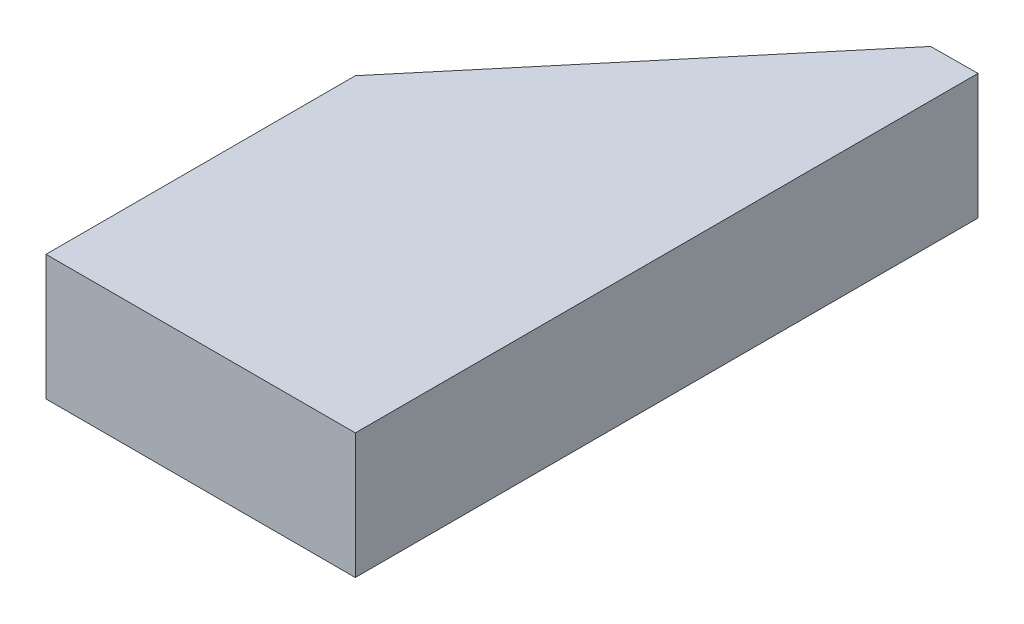
ISO-10303-21;
HEADER;
FILE_DESCRIPTION(('STEP AP214'),'2;1');
FILE_NAME('part.step','',(''),(''),'','','');
FILE_SCHEMA(('AUTOMOTIVE_DESIGN { 1 0 10303 214 1 1 1 1 }'));
ENDSEC;
DATA;
#1=APPLICATION_CONTEXT('core data for automotive mechanical design processes');
#2=APPLICATION_PROTOCOL_DEFINITION('international standard','automotive_design',2000,#1);
#3=PRODUCT_CONTEXT('',#1,'mechanical');
#4=PRODUCT('Part','Part','',(#3));
#5=PRODUCT_RELATED_PRODUCT_CATEGORY('part','',(#4));
#6=PRODUCT_DEFINITION_FORMATION('','',#4);
#7=PRODUCT_DEFINITION_CONTEXT('part definition',#1,'design');
#8=PRODUCT_DEFINITION('design','',#6,#7);
#9=PRODUCT_DEFINITION_SHAPE('','',#8);
#10=(LENGTH_UNIT() NAMED_UNIT(*) SI_UNIT(.MILLI.,.METRE.));
#11=(NAMED_UNIT(*) PLANE_ANGLE_UNIT() SI_UNIT($,.RADIAN.));
#12=(NAMED_UNIT(*) SI_UNIT($,.STERADIAN.) SOLID_ANGLE_UNIT());
#13=UNCERTAINTY_MEASURE_WITH_UNIT(LENGTH_MEASURE(1.E-05),#10,'distance_accuracy_value','');
#14=(GEOMETRIC_REPRESENTATION_CONTEXT(3) GLOBAL_UNCERTAINTY_ASSIGNED_CONTEXT((#13)) GLOBAL_UNIT_ASSIGNED_CONTEXT((#10,
#11,#12)) REPRESENTATION_CONTEXT('',''));
#15=CARTESIAN_POINT('',(0.,0.,0.));
#16=DIRECTION('',(0.,0.,1.));
#17=DIRECTION('',(1.,0.,0.));
#18=AXIS2_PLACEMENT_3D('',#15,#16,#17);
#19=CARTESIAN_POINT('',(1.88196721311474,0.,7.9));
#20=DIRECTION('',(1.,0.,0.));
#21=DIRECTION('',(0.,0.,-1.));
#22=AXIS2_PLACEMENT_3D('',#19,#20,#21);
#23=PLANE('',#22);
#24=DIRECTION('',(0.,0.,-1.));
#25=VECTOR('',#24,1.);
#26=CARTESIAN_POINT('',(1.88196721311474,0.,7.9));
#27=LINE('',#26,#25);
#28=CARTESIAN_POINT('',(1.88196721311474,0.,6.7));
#29=VERTEX_POINT('',#28);
#30=CARTESIAN_POINT('',(1.88196721311474,0.,1.19113572487986));
#31=VERTEX_POINT('',#30);
#32=EDGE_CURVE('E215',#29,#31,#27,.T.);
#33=ORIENTED_EDGE('',*,*,#32,.T.);
#34=DIRECTION('',(0.,1.,0.));
#35=VECTOR('',#34,1.);
#36=CARTESIAN_POINT('',(1.88196721311474,0.,1.19113572487986));
#37=LINE('',#36,#35);
#38=CARTESIAN_POINT('',(1.88196721311474,2.,1.19113572487986));
#39=VERTEX_POINT('',#38);
#40=EDGE_CURVE('E195',#31,#39,#37,.T.);
#41=ORIENTED_EDGE('',*,*,#40,.T.);
#42=DIRECTION('',(0.,0.,-1.));
#43=VECTOR('',#42,1.);
#44=CARTESIAN_POINT('',(1.88196721311474,2.,7.9));
#45=LINE('',#44,#43);
#46=CARTESIAN_POINT('',(1.88196721311474,2.,6.7));
#47=VERTEX_POINT('',#46);
#48=EDGE_CURVE('E204',#47,#39,#45,.T.);
#49=ORIENTED_EDGE('',*,*,#48,.F.);
#50=DIRECTION('',(0.,-1.,0.));
#51=VECTOR('',#50,1.);
#52=CARTESIAN_POINT('',(1.88196721311474,0.,6.7));
#53=LINE('',#52,#51);
#54=EDGE_CURVE('E201',#47,#29,#53,.T.);
#55=ORIENTED_EDGE('',*,*,#54,.T.);
#56=EDGE_LOOP('',(#33,#41,#49,#55));
#57=FACE_BOUND('',#56,.T.);
#58=ADVANCED_FACE('F43',(#57),#23,.T.);
#59=CARTESIAN_POINT('',(7.38196721311474,0.,7.9));
#60=DIRECTION('',(-1.,0.,0.));
#61=DIRECTION('',(0.,0.,1.));
#62=AXIS2_PLACEMENT_3D('',#59,#60,#61);
#63=PLANE('',#62);
#64=DIRECTION('',(0.,0.,-1.));
#65=VECTOR('',#64,1.);
#66=CARTESIAN_POINT('',(7.38196721311474,2.,7.9));
#67=LINE('',#66,#65);
#68=CARTESIAN_POINT('',(7.38196721311474,2.,6.7));
#69=VERTEX_POINT('',#68);
#70=CARTESIAN_POINT('',(7.38196721311474,2.,1.19113572487986));
#71=VERTEX_POINT('',#70);
#72=EDGE_CURVE('E207',#69,#71,#67,.T.);
#73=ORIENTED_EDGE('',*,*,#72,.T.);
#74=DIRECTION('',(0.,1.,0.));
#75=VECTOR('',#74,1.);
#76=CARTESIAN_POINT('',(7.38196721311474,0.,1.19113572487986));
#77=LINE('',#76,#75);
#78=CARTESIAN_POINT('',(7.38196721311474,0.,1.19113572487986));
#79=VERTEX_POINT('',#78);
#80=EDGE_CURVE('E199',#79,#71,#77,.T.);
#81=ORIENTED_EDGE('',*,*,#80,.F.);
#82=DIRECTION('',(0.,0.,-1.));
#83=VECTOR('',#82,1.);
#84=CARTESIAN_POINT('',(7.38196721311474,0.,7.9));
#85=LINE('',#84,#83);
#86=CARTESIAN_POINT('',(7.38196721311474,0.,6.7));
#87=VERTEX_POINT('',#86);
#88=EDGE_CURVE('E213',#87,#79,#85,.T.);
#89=ORIENTED_EDGE('',*,*,#88,.F.);
#90=DIRECTION('',(0.,1.,0.));
#91=VECTOR('',#90,1.);
#92=CARTESIAN_POINT('',(7.38196721311474,0.,6.7));
#93=LINE('',#92,#91);
#94=EDGE_CURVE('E210',#87,#69,#93,.T.);
#95=ORIENTED_EDGE('',*,*,#94,.T.);
#96=EDGE_LOOP('',(#73,#81,#89,#95));
#97=FACE_BOUND('',#96,.T.);
#98=ADVANCED_FACE('F300',(#97),#63,.T.);
#99=CARTESIAN_POINT('',(0.681967213114738,2.,7.9));
#100=DIRECTION('',(0.,-1.,0.));
#101=DIRECTION('',(1.,0.,0.));
#102=AXIS2_PLACEMENT_3D('',#99,#100,#101);
#103=PLANE('',#102);
#104=ORIENTED_EDGE('',*,*,#48,.T.);
#105=DIRECTION('',(-1.,0.,0.));
#106=VECTOR('',#105,1.);
#107=CARTESIAN_POINT('',(1.88196721311474,2.,1.19113572487986));
#108=LINE('',#107,#106);
#109=EDGE_CURVE('E192',#71,#39,#108,.T.);
#110=ORIENTED_EDGE('',*,*,#109,.F.);
#111=ORIENTED_EDGE('',*,*,#72,.F.);
#112=DIRECTION('',(-1.,0.,0.));
#113=VECTOR('',#112,1.);
#114=CARTESIAN_POINT('',(0.,2.,6.7));
#115=LINE('',#114,#113);
#116=EDGE_CURVE('E208',#69,#47,#115,.T.);
#117=ORIENTED_EDGE('',*,*,#116,.T.);
#118=EDGE_LOOP('',(#104,#110,#111,#117));
#119=FACE_BOUND('',#118,.T.);
#120=ADVANCED_FACE('F306',(#119),#103,.T.);
#121=CARTESIAN_POINT('',(0.681967213114738,0.,7.9));
#122=DIRECTION('',(0.,1.,0.));
#123=DIRECTION('',(0.,0.,1.));
#124=AXIS2_PLACEMENT_3D('',#121,#122,#123);
#125=PLANE('',#124);
#126=DIRECTION('',(0.642332241079395,0.,-0.766426312224419));
#127=VECTOR('',#126,1.);
#128=CARTESIAN_POINT('',(7.38196721311474,0.,-7.99439287567833));
#129=LINE('',#128,#127);
#130=CARTESIAN_POINT('',(0.681967213114738,0.,0.));
#131=VERTEX_POINT('',#130);
#132=CARTESIAN_POINT('',(1.94947445264716,0.,-1.51238072322219));
#133=VERTEX_POINT('',#132);
#134=EDGE_CURVE('E187',#131,#133,#129,.T.);
#135=ORIENTED_EDGE('',*,*,#134,.T.);
#136=DIRECTION('',(-0.807139997417087,0.,-0.590360080433582));
#137=VECTOR('',#136,1.);
#138=CARTESIAN_POINT('',(2.7061406262246,0.,-0.958938316051146));
#139=LINE('',#138,#137);
#140=CARTESIAN_POINT('',(2.7061406262246,0.,-0.958938316051146));
#141=VERTEX_POINT('',#140);
#142=EDGE_CURVE('E246',#141,#133,#139,.T.);
#143=ORIENTED_EDGE('',*,*,#142,.F.);
#144=DIRECTION('',(0.590360080433582,0.,-0.807139997417087));
#145=VECTOR('',#144,1.);
#146=CARTESIAN_POINT('',(2.36139011212092,0.,-0.4875955910166));
#147=LINE('',#146,#145);
#148=CARTESIAN_POINT('',(2.36139011212092,0.,-0.4875955910166));
#149=VERTEX_POINT('',#148);
#150=EDGE_CURVE('E262',#149,#141,#147,.T.);
#151=ORIENTED_EDGE('',*,*,#150,.F.);
#152=DIRECTION('',(0.,0.,-1.));
#153=VECTOR('',#152,1.);
#154=CARTESIAN_POINT('',(2.36139011212092,0.,0.));
#155=LINE('',#154,#153);
#156=CARTESIAN_POINT('',(2.36139011212092,0.,0.));
#157=VERTEX_POINT('',#156);
#158=EDGE_CURVE('E259',#157,#149,#155,.T.);
#159=ORIENTED_EDGE('',*,*,#158,.F.);
#160=DIRECTION('',(-1.,0.,0.));
#161=VECTOR('',#160,1.);
#162=CARTESIAN_POINT('',(7.38196721311474,0.,0.));
#163=LINE('',#162,#161);
#164=CARTESIAN_POINT('',(7.38196721311474,0.,0.));
#165=VERTEX_POINT('',#164);
#166=EDGE_CURVE('E252',#165,#157,#163,.T.);
#167=ORIENTED_EDGE('',*,*,#166,.F.);
#168=DIRECTION('',(0.,0.,1.));
#169=VECTOR('',#168,1.);
#170=CARTESIAN_POINT('',(7.38196721311474,0.,-1.2));
#171=LINE('',#170,#169);
#172=CARTESIAN_POINT('',(7.38196721311474,0.,-7.99439287567833));
#173=VERTEX_POINT('',#172);
#174=EDGE_CURVE('E250',#173,#165,#171,.T.);
#175=ORIENTED_EDGE('',*,*,#174,.F.);
#176=DIRECTION('',(0.999974178282738,0.,-0.00718629026424856));
#177=VECTOR('',#176,1.);
#178=CARTESIAN_POINT('',(8.58196721311474,0.,-8.003016646676));
#179=LINE('',#178,#177);
#180=CARTESIAN_POINT('',(8.58196721311474,0.,-8.003016646676));
#181=VERTEX_POINT('',#180);
#182=EDGE_CURVE('E173',#173,#181,#179,.T.);
#183=ORIENTED_EDGE('',*,*,#182,.T.);
#184=DIRECTION('',(0.,0.,-1.));
#185=VECTOR('',#184,1.);
#186=CARTESIAN_POINT('',(8.58196721311474,0.,7.9));
#187=LINE('',#186,#185);
#188=CARTESIAN_POINT('',(8.58196721311474,0.,7.9));
#189=VERTEX_POINT('',#188);
#190=EDGE_CURVE('E234',#189,#181,#187,.T.);
#191=ORIENTED_EDGE('',*,*,#190,.F.);
#192=DIRECTION('',(1.,0.,0.));
#193=VECTOR('',#192,1.);
#194=CARTESIAN_POINT('',(0.681967213114738,0.,7.9));
#195=LINE('',#194,#193);
#196=CARTESIAN_POINT('',(0.681967213114738,0.,7.9));
#197=VERTEX_POINT('',#196);
#198=EDGE_CURVE('E225',#197,#189,#195,.T.);
#199=ORIENTED_EDGE('',*,*,#198,.F.);
#200=DIRECTION('',(0.,0.,-1.));
#201=VECTOR('',#200,1.);
#202=CARTESIAN_POINT('',(0.681967213114738,0.,7.9));
#203=LINE('',#202,#201);
#204=EDGE_CURVE('E154',#197,#131,#203,.T.);
#205=ORIENTED_EDGE('',*,*,#204,.T.);
#206=EDGE_LOOP('',(#135,#143,#151,#159,#167,#175,#183,#191,#199,#205));
#207=FACE_BOUND('',#206,.T.);
#208=DIRECTION('',(-1.,0.,0.));
#209=VECTOR('',#208,1.);
#210=CARTESIAN_POINT('',(1.88196721311474,0.,1.19113572487986));
#211=LINE('',#210,#209);
#212=EDGE_CURVE('E193',#79,#31,#211,.T.);
#213=ORIENTED_EDGE('',*,*,#212,.T.);
#214=ORIENTED_EDGE('',*,*,#32,.F.);
#215=DIRECTION('',(1.,0.,0.));
#216=VECTOR('',#215,1.);
#217=CARTESIAN_POINT('',(0.,0.,6.7));
#218=LINE('',#217,#216);
#219=EDGE_CURVE('E203',#29,#87,#218,.T.);
#220=ORIENTED_EDGE('',*,*,#219,.T.);
#221=ORIENTED_EDGE('',*,*,#88,.T.);
#222=EDGE_LOOP('',(#213,#214,#220,#221));
#223=FACE_BOUND('',#222,.T.);
#224=ADVANCED_FACE('F240',(#207,#223),#125,.F.);
#225=CARTESIAN_POINT('',(0.681967213114738,0.,7.9));
#226=DIRECTION('',(1.,0.,0.));
#227=DIRECTION('',(0.,0.,-1.));
#228=AXIS2_PLACEMENT_3D('',#225,#226,#227);
#229=PLANE('',#228);
#230=DIRECTION('',(0.,0.,-1.));
#231=VECTOR('',#230,1.);
#232=CARTESIAN_POINT('',(0.681967213114738,3.2,7.9));
#233=LINE('',#232,#231);
#234=CARTESIAN_POINT('',(0.681967213114738,3.2,7.9));
#235=VERTEX_POINT('',#234);
#236=CARTESIAN_POINT('',(0.681967213114738,3.2,0.));
#237=VERTEX_POINT('',#236);
#238=EDGE_CURVE('E65',#235,#237,#233,.T.);
#239=ORIENTED_EDGE('',*,*,#238,.T.);
#240=DIRECTION('',(0.,-1.,0.));
#241=VECTOR('',#240,1.);
#242=CARTESIAN_POINT('',(0.681967213114738,3.2,0.));
#243=LINE('',#242,#241);
#244=EDGE_CURVE('E190',#237,#131,#243,.T.);
#245=ORIENTED_EDGE('',*,*,#244,.T.);
#246=ORIENTED_EDGE('',*,*,#204,.F.);
#247=DIRECTION('',(0.,-1.,0.));
#248=VECTOR('',#247,1.);
#249=CARTESIAN_POINT('',(0.681967213114738,0.,7.9));
#250=LINE('',#249,#248);
#251=EDGE_CURVE('E218',#235,#197,#250,.T.);
#252=ORIENTED_EDGE('',*,*,#251,.F.);
#253=EDGE_LOOP('',(#239,#245,#246,#252));
#254=FACE_BOUND('',#253,.T.);
#255=ADVANCED_FACE('F45',(#254),#229,.F.);
#256=CARTESIAN_POINT('',(8.58196721311474,0.,7.9));
#257=DIRECTION('',(-1.,0.,0.));
#258=DIRECTION('',(0.,0.,1.));
#259=AXIS2_PLACEMENT_3D('',#256,#257,#258);
#260=PLANE('',#259);
#261=ORIENTED_EDGE('',*,*,#190,.T.);
#262=DIRECTION('',(0.,-1.,0.));
#263=VECTOR('',#262,1.);
#264=CARTESIAN_POINT('',(8.58196721311474,3.2,-8.003016646676));
#265=LINE('',#264,#263);
#266=CARTESIAN_POINT('',(8.58196721311474,3.2,-8.003016646676));
#267=VERTEX_POINT('',#266);
#268=EDGE_CURVE('E181',#267,#181,#265,.T.);
#269=ORIENTED_EDGE('',*,*,#268,.F.);
#270=DIRECTION('',(0.,0.,-1.));
#271=VECTOR('',#270,1.);
#272=CARTESIAN_POINT('',(8.58196721311474,3.2,7.9));
#273=LINE('',#272,#271);
#274=CARTESIAN_POINT('',(8.58196721311474,3.2,7.9));
#275=VERTEX_POINT('',#274);
#276=EDGE_CURVE('E232',#275,#267,#273,.T.);
#277=ORIENTED_EDGE('',*,*,#276,.F.);
#278=DIRECTION('',(0.,1.,0.));
#279=VECTOR('',#278,1.);
#280=CARTESIAN_POINT('',(8.58196721311474,0.,7.9));
#281=LINE('',#280,#279);
#282=EDGE_CURVE('E227',#189,#275,#281,.T.);
#283=ORIENTED_EDGE('',*,*,#282,.F.);
#284=EDGE_LOOP('',(#261,#269,#277,#283));
#285=FACE_BOUND('',#284,.T.);
#286=ADVANCED_FACE('F274',(#285),#260,.F.);
#287=CARTESIAN_POINT('',(0.681967213114738,3.2,7.9));
#288=DIRECTION('',(0.,-1.,0.));
#289=DIRECTION('',(1.,0.,0.));
#290=AXIS2_PLACEMENT_3D('',#287,#288,#289);
#291=PLANE('',#290);
#292=ORIENTED_EDGE('',*,*,#276,.T.);
#293=DIRECTION('',(0.999974178282738,0.,-0.00718629026424856));
#294=VECTOR('',#293,1.);
#295=CARTESIAN_POINT('',(8.58196721311474,3.2,-8.003016646676));
#296=LINE('',#295,#294);
#297=CARTESIAN_POINT('',(7.38196721311474,3.2,-7.99439287567833));
#298=VERTEX_POINT('',#297);
#299=EDGE_CURVE('E183',#298,#267,#296,.T.);
#300=ORIENTED_EDGE('',*,*,#299,.F.);
#301=DIRECTION('',(0.642332241079395,0.,-0.766426312224419));
#302=VECTOR('',#301,1.);
#303=CARTESIAN_POINT('',(7.38196721311474,3.2,-7.99439287567833));
#304=LINE('',#303,#302);
#305=EDGE_CURVE('E179',#237,#298,#304,.T.);
#306=ORIENTED_EDGE('',*,*,#305,.F.);
#307=ORIENTED_EDGE('',*,*,#238,.F.);
#308=DIRECTION('',(-1.,0.,0.));
#309=VECTOR('',#308,1.);
#310=CARTESIAN_POINT('',(0.681967213114738,3.2,7.9));
#311=LINE('',#310,#309);
#312=EDGE_CURVE('E229',#275,#235,#311,.T.);
#313=ORIENTED_EDGE('',*,*,#312,.F.);
#314=EDGE_LOOP('',(#292,#300,#306,#307,#313));
#315=FACE_BOUND('',#314,.T.);
#316=ADVANCED_FACE('F323',(#315),#291,.F.);
#317=CARTESIAN_POINT('',(0.,0.,7.9));
#318=DIRECTION('',(0.,0.,-1.));
#319=DIRECTION('',(-1.,0.,0.));
#320=AXIS2_PLACEMENT_3D('',#317,#318,#319);
#321=PLANE('',#320);
#322=ORIENTED_EDGE('',*,*,#251,.T.);
#323=ORIENTED_EDGE('',*,*,#198,.T.);
#324=ORIENTED_EDGE('',*,*,#282,.T.);
#325=ORIENTED_EDGE('',*,*,#312,.T.);
#326=EDGE_LOOP('',(#322,#323,#324,#325));
#327=FACE_BOUND('',#326,.T.);
#328=ADVANCED_FACE('F319',(#327),#321,.F.);
#329=CARTESIAN_POINT('',(0.,0.,6.7));
#330=DIRECTION('',(0.,0.,-1.));
#331=DIRECTION('',(-1.,0.,0.));
#332=AXIS2_PLACEMENT_3D('',#329,#330,#331);
#333=PLANE('',#332);
#334=ORIENTED_EDGE('',*,*,#54,.F.);
#335=ORIENTED_EDGE('',*,*,#116,.F.);
#336=ORIENTED_EDGE('',*,*,#94,.F.);
#337=ORIENTED_EDGE('',*,*,#219,.F.);
#338=EDGE_LOOP('',(#334,#335,#336,#337));
#339=FACE_BOUND('',#338,.T.);
#340=ADVANCED_FACE('F316',(#339),#333,.T.);
#341=CARTESIAN_POINT('',(1.88196721311474,0.,1.19113572487986));
#342=DIRECTION('',(0.,0.,-1.));
#343=DIRECTION('',(-1.,0.,0.));
#344=AXIS2_PLACEMENT_3D('',#341,#342,#343);
#345=PLANE('',#344);
#346=ORIENTED_EDGE('',*,*,#109,.T.);
#347=ORIENTED_EDGE('',*,*,#40,.F.);
#348=ORIENTED_EDGE('',*,*,#212,.F.);
#349=ORIENTED_EDGE('',*,*,#80,.T.);
#350=EDGE_LOOP('',(#346,#347,#348,#349));
#351=FACE_BOUND('',#350,.T.);
#352=ADVANCED_FACE('F310',(#351),#345,.F.);
#353=CARTESIAN_POINT('',(8.58196721311474,3.2,-8.003016646676));
#354=DIRECTION('',(-0.00718629026424856,0.,-0.999974178282738));
#355=DIRECTION('',(-0.999974178282739,0.,0.00718629026424856));
#356=AXIS2_PLACEMENT_3D('',#353,#354,#355);
#357=PLANE('',#356);
#358=ORIENTED_EDGE('',*,*,#268,.T.);
#359=ORIENTED_EDGE('',*,*,#182,.F.);
#360=DIRECTION('',(0.,-1.,0.));
#361=VECTOR('',#360,1.);
#362=CARTESIAN_POINT('',(7.38196721311474,2.,-7.99439287567833));
#363=LINE('',#362,#361);
#364=CARTESIAN_POINT('',(7.38196721311474,2.,-7.99439287567833));
#365=VERTEX_POINT('',#364);
#366=EDGE_CURVE('E159',#365,#173,#363,.T.);
#367=ORIENTED_EDGE('',*,*,#366,.F.);
#368=DIRECTION('',(0.,-1.,0.));
#369=VECTOR('',#368,1.);
#370=CARTESIAN_POINT('',(7.38196721311474,3.2,-7.99439287567833));
#371=LINE('',#370,#369);
#372=EDGE_CURVE('E171',#298,#365,#371,.T.);
#373=ORIENTED_EDGE('',*,*,#372,.F.);
#374=ORIENTED_EDGE('',*,*,#299,.T.);
#375=EDGE_LOOP('',(#358,#359,#367,#373,#374));
#376=FACE_BOUND('',#375,.T.);
#377=ADVANCED_FACE('F169',(#376),#357,.T.);
#378=CARTESIAN_POINT('',(7.38196721311474,3.2,-7.99439287567833));
#379=DIRECTION('',(-0.766426312224419,0.,-0.642332241079395));
#380=DIRECTION('',(-0.642332241079395,0.,0.766426312224419));
#381=AXIS2_PLACEMENT_3D('',#378,#379,#380);
#382=PLANE('',#381);
#383=DIRECTION('',(0.,1.,0.));
#384=VECTOR('',#383,1.);
#385=CARTESIAN_POINT('',(1.94947445264716,3.2,-1.5123807232222));
#386=LINE('',#385,#384);
#387=CARTESIAN_POINT('',(1.94947445264716,2.,-1.51238072322219));
#388=VERTEX_POINT('',#387);
#389=EDGE_CURVE('E11',#133,#388,#386,.T.);
#390=ORIENTED_EDGE('',*,*,#389,.F.);
#391=ORIENTED_EDGE('',*,*,#134,.F.);
#392=ORIENTED_EDGE('',*,*,#244,.F.);
#393=ORIENTED_EDGE('',*,*,#305,.T.);
#394=ORIENTED_EDGE('',*,*,#372,.T.);
#395=DIRECTION('',(-0.642332241079395,0.,0.766426312224419));
#396=VECTOR('',#395,1.);
#397=CARTESIAN_POINT('',(7.38196721311474,2.,-7.99439287567833));
#398=LINE('',#397,#396);
#399=EDGE_CURVE('E51',#365,#388,#398,.T.);
#400=ORIENTED_EDGE('',*,*,#399,.T.);
#401=EDGE_LOOP('',(#390,#391,#392,#393,#394,#400));
#402=FACE_BOUND('',#401,.T.);
#403=ADVANCED_FACE('F177',(#402),#382,.T.);
#404=CARTESIAN_POINT('',(2.7061406262246,2.,-0.958938316051146));
#405=DIRECTION('',(-0.590360080433582,0.,0.807139997417087));
#406=DIRECTION('',(0.807139997417087,0.,0.590360080433582));
#407=AXIS2_PLACEMENT_3D('',#404,#405,#406);
#408=PLANE('',#407);
#409=ORIENTED_EDGE('',*,*,#389,.T.);
#410=DIRECTION('',(-0.807139997417087,0.,-0.590360080433582));
#411=VECTOR('',#410,1.);
#412=CARTESIAN_POINT('',(2.7061406262246,2.,-0.958938316051146));
#413=LINE('',#412,#411);
#414=CARTESIAN_POINT('',(2.7061406262246,2.,-0.958938316051146));
#415=VERTEX_POINT('',#414);
#416=EDGE_CURVE('E58',#415,#388,#413,.T.);
#417=ORIENTED_EDGE('',*,*,#416,.F.);
#418=DIRECTION('',(0.,-1.,0.));
#419=VECTOR('',#418,1.);
#420=CARTESIAN_POINT('',(2.7061406262246,2.,-0.958938316051146));
#421=LINE('',#420,#419);
#422=EDGE_CURVE('E247',#415,#141,#421,.T.);
#423=ORIENTED_EDGE('',*,*,#422,.T.);
#424=ORIENTED_EDGE('',*,*,#142,.T.);
#425=EDGE_LOOP('',(#409,#417,#423,#424));
#426=FACE_BOUND('',#425,.T.);
#427=ADVANCED_FACE('F245',(#426),#408,.F.);
#428=CARTESIAN_POINT('',(2.36139011212092,2.,-0.4875955910166));
#429=DIRECTION('',(-0.807139997417087,0.,-0.590360080433582));
#430=DIRECTION('',(-0.590360080433582,0.,0.807139997417087));
#431=AXIS2_PLACEMENT_3D('',#428,#429,#430);
#432=PLANE('',#431);
#433=ORIENTED_EDGE('',*,*,#150,.T.);
#434=ORIENTED_EDGE('',*,*,#422,.F.);
#435=DIRECTION('',(0.590360080433582,0.,-0.807139997417087));
#436=VECTOR('',#435,1.);
#437=CARTESIAN_POINT('',(2.36139011212092,2.,-0.4875955910166));
#438=LINE('',#437,#436);
#439=CARTESIAN_POINT('',(2.36139011212092,2.,-0.4875955910166));
#440=VERTEX_POINT('',#439);
#441=EDGE_CURVE('E174',#440,#415,#438,.T.);
#442=ORIENTED_EDGE('',*,*,#441,.F.);
#443=DIRECTION('',(0.,-1.,0.));
#444=VECTOR('',#443,1.);
#445=CARTESIAN_POINT('',(2.36139011212092,2.,-0.4875955910166));
#446=LINE('',#445,#444);
#447=EDGE_CURVE('E265',#440,#149,#446,.T.);
#448=ORIENTED_EDGE('',*,*,#447,.T.);
#449=EDGE_LOOP('',(#433,#434,#442,#448));
#450=FACE_BOUND('',#449,.T.);
#451=ADVANCED_FACE('F288',(#450),#432,.F.);
#452=CARTESIAN_POINT('',(2.36139011212092,2.,0.));
#453=DIRECTION('',(-1.,0.,0.));
#454=DIRECTION('',(0.,0.,1.));
#455=AXIS2_PLACEMENT_3D('',#452,#453,#454);
#456=PLANE('',#455);
#457=ORIENTED_EDGE('',*,*,#158,.T.);
#458=ORIENTED_EDGE('',*,*,#447,.F.);
#459=DIRECTION('',(0.,0.,-1.));
#460=VECTOR('',#459,1.);
#461=CARTESIAN_POINT('',(2.36139011212092,2.,0.));
#462=LINE('',#461,#460);
#463=CARTESIAN_POINT('',(2.36139011212092,2.,0.));
#464=VERTEX_POINT('',#463);
#465=EDGE_CURVE('E283',#464,#440,#462,.T.);
#466=ORIENTED_EDGE('',*,*,#465,.F.);
#467=DIRECTION('',(0.,-1.,0.));
#468=VECTOR('',#467,1.);
#469=CARTESIAN_POINT('',(2.36139011212092,2.,0.));
#470=LINE('',#469,#468);
#471=EDGE_CURVE('E267',#464,#157,#470,.T.);
#472=ORIENTED_EDGE('',*,*,#471,.T.);
#473=EDGE_LOOP('',(#457,#458,#466,#472));
#474=FACE_BOUND('',#473,.T.);
#475=ADVANCED_FACE('F290',(#474),#456,.F.);
#476=CARTESIAN_POINT('',(7.38196721311474,2.,0.));
#477=DIRECTION('',(0.,0.,1.));
#478=DIRECTION('',(1.,0.,0.));
#479=AXIS2_PLACEMENT_3D('',#476,#477,#478);
#480=PLANE('',#479);
#481=ORIENTED_EDGE('',*,*,#166,.T.);
#482=ORIENTED_EDGE('',*,*,#471,.F.);
#483=DIRECTION('',(-1.,0.,0.));
#484=VECTOR('',#483,1.);
#485=CARTESIAN_POINT('',(7.38196721311474,2.,0.));
#486=LINE('',#485,#484);
#487=CARTESIAN_POINT('',(7.38196721311474,2.,0.));
#488=VERTEX_POINT('',#487);
#489=EDGE_CURVE('E163',#488,#464,#486,.T.);
#490=ORIENTED_EDGE('',*,*,#489,.F.);
#491=DIRECTION('',(0.,-1.,0.));
#492=VECTOR('',#491,1.);
#493=CARTESIAN_POINT('',(7.38196721311474,2.,0.));
#494=LINE('',#493,#492);
#495=EDGE_CURVE('E161',#488,#165,#494,.T.);
#496=ORIENTED_EDGE('',*,*,#495,.T.);
#497=EDGE_LOOP('',(#481,#482,#490,#496));
#498=FACE_BOUND('',#497,.T.);
#499=ADVANCED_FACE('F280',(#498),#480,.F.);
#500=CARTESIAN_POINT('',(7.38196721311474,2.,-1.2));
#501=DIRECTION('',(1.,0.,0.));
#502=DIRECTION('',(0.,0.,-1.));
#503=AXIS2_PLACEMENT_3D('',#500,#501,#502);
#504=PLANE('',#503);
#505=ORIENTED_EDGE('',*,*,#174,.T.);
#506=ORIENTED_EDGE('',*,*,#495,.F.);
#507=DIRECTION('',(0.,0.,1.));
#508=VECTOR('',#507,1.);
#509=CARTESIAN_POINT('',(7.38196721311474,2.,-7.99439287567833));
#510=LINE('',#509,#508);
#511=EDGE_CURVE('E149',#365,#488,#510,.T.);
#512=ORIENTED_EDGE('',*,*,#511,.F.);
#513=ORIENTED_EDGE('',*,*,#366,.T.);
#514=EDGE_LOOP('',(#505,#506,#512,#513));
#515=FACE_BOUND('',#514,.T.);
#516=ADVANCED_FACE('F158',(#515),#504,.F.);
#517=CARTESIAN_POINT('',(0.,2.,0.));
#518=DIRECTION('',(0.,-1.,0.));
#519=DIRECTION('',(0.,0.,-1.));
#520=AXIS2_PLACEMENT_3D('',#517,#518,#519);
#521=PLANE('',#520);
#522=ORIENTED_EDGE('',*,*,#511,.T.);
#523=ORIENTED_EDGE('',*,*,#489,.T.);
#524=ORIENTED_EDGE('',*,*,#465,.T.);
#525=ORIENTED_EDGE('',*,*,#441,.T.);
#526=ORIENTED_EDGE('',*,*,#416,.T.);
#527=ORIENTED_EDGE('',*,*,#399,.F.);
#528=EDGE_LOOP('',(#522,#523,#524,#525,#526,#527));
#529=FACE_BOUND('',#528,.T.);
#530=ADVANCED_FACE('F147',(#529),#521,.T.);
#531=CLOSED_SHELL('',(#58,#98,#120,#224,#255,#286,#316,#328,#340,#352,#377,#403,#427,#451,#475,
#499,#516,#530));
#532=MANIFOLD_SOLID_BREP('B2',#531);
#533=ADVANCED_BREP_SHAPE_REPRESENTATION('',(#18,#532),#14);
#534=SHAPE_DEFINITION_REPRESENTATION(#9,#533);
ENDSEC;
END-ISO-10303-21;
